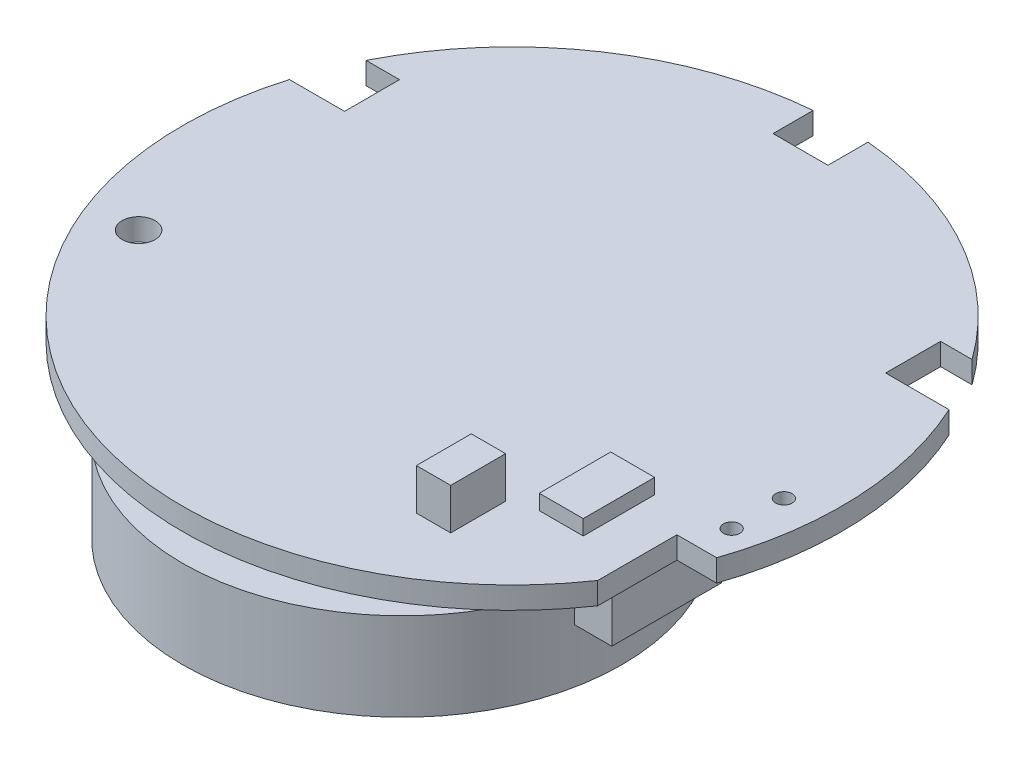
ISO-10303-21;
HEADER;
FILE_DESCRIPTION(('STEP AP214'),'2;1');
FILE_NAME('part.step','',(''),(''),'','','');
FILE_SCHEMA(('AUTOMOTIVE_DESIGN { 1 0 10303 214 1 1 1 1 }'));
ENDSEC;
DATA;
#1=APPLICATION_CONTEXT('core data for automotive mechanical design processes');
#2=APPLICATION_PROTOCOL_DEFINITION('international standard','automotive_design',2000,#1);
#3=PRODUCT_CONTEXT('',#1,'mechanical');
#4=PRODUCT('Part','Part','',(#3));
#5=PRODUCT_RELATED_PRODUCT_CATEGORY('part','',(#4));
#6=PRODUCT_DEFINITION_FORMATION('','',#4);
#7=PRODUCT_DEFINITION_CONTEXT('part definition',#1,'design');
#8=PRODUCT_DEFINITION('design','',#6,#7);
#9=PRODUCT_DEFINITION_SHAPE('','',#8);
#10=(LENGTH_UNIT() NAMED_UNIT(*) SI_UNIT(.MILLI.,.METRE.));
#11=(NAMED_UNIT(*) PLANE_ANGLE_UNIT() SI_UNIT($,.RADIAN.));
#12=(NAMED_UNIT(*) SI_UNIT($,.STERADIAN.) SOLID_ANGLE_UNIT());
#13=UNCERTAINTY_MEASURE_WITH_UNIT(LENGTH_MEASURE(1.E-05),#10,'distance_accuracy_value','');
#14=(GEOMETRIC_REPRESENTATION_CONTEXT(3) GLOBAL_UNCERTAINTY_ASSIGNED_CONTEXT((#13)) GLOBAL_UNIT_ASSIGNED_CONTEXT((#10,
#11,#12)) REPRESENTATION_CONTEXT('',''));
#15=CARTESIAN_POINT('',(0.,0.,0.));
#16=DIRECTION('',(0.,0.,1.));
#17=DIRECTION('',(1.,0.,0.));
#18=AXIS2_PLACEMENT_3D('',#15,#16,#17);
#19=CARTESIAN_POINT('',(0.,0.8,0.));
#20=DIRECTION('',(0.,1.,0.));
#21=DIRECTION('',(0.,0.,1.));
#22=AXIS2_PLACEMENT_3D('',#19,#20,#21);
#23=PLANE('',#22);
#24=DIRECTION('',(0.,0.,1.));
#25=VECTOR('',#24,1.);
#26=CARTESIAN_POINT('',(8.235,0.8,0.));
#27=LINE('',#26,#25);
#28=CARTESIAN_POINT('',(8.235,0.8,3.045));
#29=VERTEX_POINT('',#28);
#30=CARTESIAN_POINT('',(8.235,0.8,5.645));
#31=VERTEX_POINT('',#30);
#32=EDGE_CURVE('E248',#29,#31,#27,.T.);
#33=ORIENTED_EDGE('',*,*,#32,.T.);
#34=DIRECTION('',(1.,0.,0.));
#35=VECTOR('',#34,1.);
#36=CARTESIAN_POINT('',(0.,0.8,5.645));
#37=LINE('',#36,#35);
#38=CARTESIAN_POINT('',(6.635,0.8,5.645));
#39=VERTEX_POINT('',#38);
#40=EDGE_CURVE('E262',#39,#31,#37,.T.);
#41=ORIENTED_EDGE('',*,*,#40,.F.);
#42=DIRECTION('',(0.,0.,1.));
#43=VECTOR('',#42,1.);
#44=CARTESIAN_POINT('',(6.635,0.8,0.));
#45=LINE('',#44,#43);
#46=CARTESIAN_POINT('',(6.635,0.8,3.045));
#47=VERTEX_POINT('',#46);
#48=EDGE_CURVE('E275',#47,#39,#45,.T.);
#49=ORIENTED_EDGE('',*,*,#48,.F.);
#50=DIRECTION('',(1.,0.,0.));
#51=VECTOR('',#50,1.);
#52=CARTESIAN_POINT('',(0.,0.8,3.045));
#53=LINE('',#52,#51);
#54=EDGE_CURVE('E273',#47,#29,#53,.T.);
#55=ORIENTED_EDGE('',*,*,#54,.T.);
#56=EDGE_LOOP('',(#33,#41,#49,#55));
#57=FACE_BOUND('',#56,.T.);
#58=CARTESIAN_POINT('',(-9.50592004690098,0.8,4.09389595152663));
#59=DIRECTION('',(0.,1.,0.));
#60=DIRECTION('',(0.,0.,1.));
#61=AXIS2_PLACEMENT_3D('',#58,#59,#60);
#62=CIRCLE('',#61,0.6);
#63=CARTESIAN_POINT('',(-9.50592004690098,0.8,4.69389595152663));
#64=VERTEX_POINT('',#63);
#65=EDGE_CURVE('E387',#64,#64,#62,.T.);
#66=ORIENTED_EDGE('',*,*,#65,.F.);
#67=EDGE_LOOP('',(#66));
#68=FACE_BOUND('',#67,.T.);
#69=CARTESIAN_POINT('',(10.7026766628423,0.8,2.70819354010199));
#70=DIRECTION('',(0.,1.,0.));
#71=DIRECTION('',(0.,0.,1.));
#72=AXIS2_PLACEMENT_3D('',#69,#70,#71);
#73=CIRCLE('',#72,0.3);
#74=CARTESIAN_POINT('',(10.7026766628423,0.8,3.00819354010199));
#75=VERTEX_POINT('',#74);
#76=EDGE_CURVE('E393',#75,#75,#73,.T.);
#77=ORIENTED_EDGE('',*,*,#76,.F.);
#78=EDGE_LOOP('',(#77));
#79=FACE_BOUND('',#78,.T.);
#80=CARTESIAN_POINT('',(10.6997964827245,0.8,0.804521738846503));
#81=DIRECTION('',(0.,1.,0.));
#82=DIRECTION('',(0.,0.,1.));
#83=AXIS2_PLACEMENT_3D('',#80,#81,#82);
#84=CIRCLE('',#83,0.3);
#85=CARTESIAN_POINT('',(10.6997964827245,0.8,1.1045217388465));
#86=VERTEX_POINT('',#85);
#87=EDGE_CURVE('E382',#86,#86,#84,.T.);
#88=ORIENTED_EDGE('',*,*,#87,.F.);
#89=EDGE_LOOP('',(#88));
#90=FACE_BOUND('',#89,.T.);
#91=DIRECTION('',(0.,0.,1.));
#92=VECTOR('',#91,1.);
#93=CARTESIAN_POINT('',(-9.5,0.8,0.));
#94=LINE('',#93,#92);
#95=CARTESIAN_POINT('',(-9.5,0.8,-5.4));
#96=VERTEX_POINT('',#95);
#97=CARTESIAN_POINT('',(-9.5,0.8,-3.4));
#98=VERTEX_POINT('',#97);
#99=EDGE_CURVE('E409',#96,#98,#94,.T.);
#100=ORIENTED_EDGE('',*,*,#99,.T.);
#101=DIRECTION('',(-1.,0.,0.));
#102=VECTOR('',#101,1.);
#103=CARTESIAN_POINT('',(0.,0.8,-3.4));
#104=LINE('',#103,#102);
#105=CARTESIAN_POINT('',(-11.5082579046526,0.8,-3.4));
#106=VERTEX_POINT('',#105);
#107=EDGE_CURVE('E404',#98,#106,#104,.T.);
#108=ORIENTED_EDGE('',*,*,#107,.T.);
#109=CARTESIAN_POINT('',(0.,0.8,0.));
#110=DIRECTION('',(0.,1.,0.));
#111=DIRECTION('',(0.,0.,1.));
#112=AXIS2_PLACEMENT_3D('',#109,#110,#111);
#113=CIRCLE('',#112,12.);
#114=CARTESIAN_POINT('',(9.9,0.8,6.78159273327439));
#115=VERTEX_POINT('',#114);
#116=EDGE_CURVE('E45',#106,#115,#113,.T.);
#117=ORIENTED_EDGE('',*,*,#116,.T.);
#118=DIRECTION('',(0.,0.,-1.));
#119=VECTOR('',#118,1.);
#120=CARTESIAN_POINT('',(9.9,0.8,0.));
#121=LINE('',#120,#119);
#122=CARTESIAN_POINT('',(9.9,0.8,3.9));
#123=VERTEX_POINT('',#122);
#124=EDGE_CURVE('E481',#115,#123,#121,.T.);
#125=ORIENTED_EDGE('',*,*,#124,.T.);
#126=DIRECTION('',(1.,0.,0.));
#127=VECTOR('',#126,1.);
#128=CARTESIAN_POINT('',(0.,0.8,3.9));
#129=LINE('',#128,#127);
#130=CARTESIAN_POINT('',(11.3485681916266,0.8,3.9));
#131=VERTEX_POINT('',#130);
#132=EDGE_CURVE('E386',#123,#131,#129,.T.);
#133=ORIENTED_EDGE('',*,*,#132,.T.);
#134=CARTESIAN_POINT('',(10.9087121146357,0.8,-5.));
#135=VERTEX_POINT('',#134);
#136=EDGE_CURVE('E11',#131,#135,#113,.T.);
#137=ORIENTED_EDGE('',*,*,#136,.T.);
#138=DIRECTION('',(1.,0.,0.));
#139=VECTOR('',#138,1.);
#140=CARTESIAN_POINT('',(0.,0.8,-5.));
#141=LINE('',#140,#139);
#142=CARTESIAN_POINT('',(8.6,0.8,-5.));
#143=VERTEX_POINT('',#142);
#144=EDGE_CURVE('E466',#143,#135,#141,.T.);
#145=ORIENTED_EDGE('',*,*,#144,.F.);
#146=DIRECTION('',(0.,0.,1.));
#147=VECTOR('',#146,1.);
#148=CARTESIAN_POINT('',(8.6,0.8,0.));
#149=LINE('',#148,#147);
#150=CARTESIAN_POINT('',(8.6,0.8,-7.));
#151=VERTEX_POINT('',#150);
#152=EDGE_CURVE('E463',#151,#143,#149,.T.);
#153=ORIENTED_EDGE('',*,*,#152,.F.);
#154=DIRECTION('',(-1.,0.,0.));
#155=VECTOR('',#154,1.);
#156=CARTESIAN_POINT('',(0.,0.8,-7.));
#157=LINE('',#156,#155);
#158=CARTESIAN_POINT('',(9.74679434480897,0.8,-7.));
#159=VERTEX_POINT('',#158);
#160=EDGE_CURVE('E456',#159,#151,#157,.T.);
#161=ORIENTED_EDGE('',*,*,#160,.F.);
#162=CARTESIAN_POINT('',(1.,0.8,-11.9582607431014));
#163=VERTEX_POINT('',#162);
#164=EDGE_CURVE('E44',#159,#163,#113,.T.);
#165=ORIENTED_EDGE('',*,*,#164,.T.);
#166=DIRECTION('',(0.,0.,1.));
#167=VECTOR('',#166,1.);
#168=CARTESIAN_POINT('',(1.,0.8,0.));
#169=LINE('',#168,#167);
#170=CARTESIAN_POINT('',(1.,0.8,-10.5));
#171=VERTEX_POINT('',#170);
#172=EDGE_CURVE('E430',#163,#171,#169,.T.);
#173=ORIENTED_EDGE('',*,*,#172,.T.);
#174=DIRECTION('',(-1.,0.,0.));
#175=VECTOR('',#174,1.);
#176=CARTESIAN_POINT('',(0.,0.8,-10.5));
#177=LINE('',#176,#175);
#178=CARTESIAN_POINT('',(-0.999999999999999,0.8,-10.5));
#179=VERTEX_POINT('',#178);
#180=EDGE_CURVE('E439',#171,#179,#177,.T.);
#181=ORIENTED_EDGE('',*,*,#180,.T.);
#182=DIRECTION('',(0.,0.,-1.));
#183=VECTOR('',#182,1.);
#184=CARTESIAN_POINT('',(-0.999999999999997,0.8,0.));
#185=LINE('',#184,#183);
#186=CARTESIAN_POINT('',(-0.999999999999999,0.8,-11.9582607431014));
#187=VERTEX_POINT('',#186);
#188=EDGE_CURVE('E436',#179,#187,#185,.T.);
#189=ORIENTED_EDGE('',*,*,#188,.T.);
#190=CARTESIAN_POINT('',(-10.7163426596951,0.8,-5.4));
#191=VERTEX_POINT('',#190);
#192=EDGE_CURVE('E493',#187,#191,#113,.T.);
#193=ORIENTED_EDGE('',*,*,#192,.T.);
#194=DIRECTION('',(1.,0.,0.));
#195=VECTOR('',#194,1.);
#196=CARTESIAN_POINT('',(0.,0.8,-5.4));
#197=LINE('',#196,#195);
#198=EDGE_CURVE('E412',#191,#96,#197,.T.);
#199=ORIENTED_EDGE('',*,*,#198,.T.);
#200=EDGE_LOOP('',(#100,#108,#117,#125,#133,#137,#145,#153,#161,#165,#173,#181,#189,#193,#199));
#201=FACE_BOUND('',#200,.T.);
#202=DIRECTION('',(-1.,0.,0.));
#203=VECTOR('',#202,1.);
#204=CARTESIAN_POINT('',(4.475,0.8,5.96));
#205=LINE('',#204,#203);
#206=CARTESIAN_POINT('',(5.725,0.8,5.96));
#207=VERTEX_POINT('',#206);
#208=CARTESIAN_POINT('',(4.475,0.8,5.96));
#209=VERTEX_POINT('',#208);
#210=EDGE_CURVE('E294',#207,#209,#205,.T.);
#211=ORIENTED_EDGE('',*,*,#210,.F.);
#212=DIRECTION('',(0.,0.,-1.));
#213=VECTOR('',#212,1.);
#214=CARTESIAN_POINT('',(5.725,0.8,5.96));
#215=LINE('',#214,#213);
#216=CARTESIAN_POINT('',(5.725,0.8,7.96));
#217=VERTEX_POINT('',#216);
#218=EDGE_CURVE('E253',#217,#207,#215,.T.);
#219=ORIENTED_EDGE('',*,*,#218,.F.);
#220=DIRECTION('',(1.,0.,0.));
#221=VECTOR('',#220,1.);
#222=CARTESIAN_POINT('',(4.475,0.8,7.96));
#223=LINE('',#222,#221);
#224=CARTESIAN_POINT('',(4.475,0.8,7.96));
#225=VERTEX_POINT('',#224);
#226=EDGE_CURVE('E285',#225,#217,#223,.T.);
#227=ORIENTED_EDGE('',*,*,#226,.F.);
#228=DIRECTION('',(0.,0.,1.));
#229=VECTOR('',#228,1.);
#230=CARTESIAN_POINT('',(4.475,0.8,5.96));
#231=LINE('',#230,#229);
#232=EDGE_CURVE('E296',#209,#225,#231,.T.);
#233=ORIENTED_EDGE('',*,*,#232,.F.);
#234=EDGE_LOOP('',(#211,#219,#227,#233));
#235=FACE_BOUND('',#234,.T.);
#236=ADVANCED_FACE('F35',(#57,#68,#79,#90,#201,#235),#23,.T.);
#237=CARTESIAN_POINT('',(0.,0.,0.));
#238=DIRECTION('',(0.,1.,0.));
#239=DIRECTION('',(0.,0.,1.));
#240=AXIS2_PLACEMENT_3D('',#237,#238,#239);
#241=PLANE('',#240);
#242=DIRECTION('',(0.,0.,-1.));
#243=VECTOR('',#242,1.);
#244=CARTESIAN_POINT('',(-4.,0.,2.));
#245=LINE('',#244,#243);
#246=CARTESIAN_POINT('',(-4.,0.,6.));
#247=VERTEX_POINT('',#246);
#248=CARTESIAN_POINT('',(-4.,0.,2.));
#249=VERTEX_POINT('',#248);
#250=EDGE_CURVE('E344',#247,#249,#245,.T.);
#251=ORIENTED_EDGE('',*,*,#250,.F.);
#252=DIRECTION('',(-1.,0.,0.));
#253=VECTOR('',#252,1.);
#254=CARTESIAN_POINT('',(4.,0.,6.));
#255=LINE('',#254,#253);
#256=CARTESIAN_POINT('',(4.,0.,6.));
#257=VERTEX_POINT('',#256);
#258=EDGE_CURVE('E351',#257,#247,#255,.T.);
#259=ORIENTED_EDGE('',*,*,#258,.F.);
#260=DIRECTION('',(0.,0.,1.));
#261=VECTOR('',#260,1.);
#262=CARTESIAN_POINT('',(4.,0.,2.));
#263=LINE('',#262,#261);
#264=CARTESIAN_POINT('',(4.,0.,2.));
#265=VERTEX_POINT('',#264);
#266=EDGE_CURVE('E366',#265,#257,#263,.T.);
#267=ORIENTED_EDGE('',*,*,#266,.F.);
#268=DIRECTION('',(1.,0.,0.));
#269=VECTOR('',#268,1.);
#270=CARTESIAN_POINT('',(4.,0.,2.));
#271=LINE('',#270,#269);
#272=EDGE_CURVE('E363',#249,#265,#271,.T.);
#273=ORIENTED_EDGE('',*,*,#272,.F.);
#274=EDGE_LOOP('',(#251,#259,#267,#273));
#275=FACE_BOUND('',#274,.T.);
#276=CARTESIAN_POINT('',(-9.50592004690098,0.,4.09389595152663));
#277=DIRECTION('',(0.,1.,0.));
#278=DIRECTION('',(0.,0.,1.));
#279=AXIS2_PLACEMENT_3D('',#276,#277,#278);
#280=CIRCLE('',#279,0.6);
#281=CARTESIAN_POINT('',(-9.50592004690098,0.,4.69389595152663));
#282=VERTEX_POINT('',#281);
#283=EDGE_CURVE('E383',#282,#282,#280,.T.);
#284=ORIENTED_EDGE('',*,*,#283,.T.);
#285=EDGE_LOOP('',(#284));
#286=FACE_BOUND('',#285,.T.);
#287=CARTESIAN_POINT('',(10.7026766628423,0.,2.70819354010199));
#288=DIRECTION('',(0.,1.,0.));
#289=DIRECTION('',(0.,0.,1.));
#290=AXIS2_PLACEMENT_3D('',#287,#288,#289);
#291=CIRCLE('',#290,0.3);
#292=CARTESIAN_POINT('',(10.7026766628423,0.,3.00819354010199));
#293=VERTEX_POINT('',#292);
#294=EDGE_CURVE('E390',#293,#293,#291,.T.);
#295=ORIENTED_EDGE('',*,*,#294,.T.);
#296=EDGE_LOOP('',(#295));
#297=FACE_BOUND('',#296,.T.);
#298=CARTESIAN_POINT('',(10.6997964827245,0.,0.804521738846503));
#299=DIRECTION('',(0.,1.,0.));
#300=DIRECTION('',(0.,0.,1.));
#301=AXIS2_PLACEMENT_3D('',#298,#299,#300);
#302=CIRCLE('',#301,0.3);
#303=CARTESIAN_POINT('',(10.6997964827245,0.,1.1045217388465));
#304=VERTEX_POINT('',#303);
#305=EDGE_CURVE('E396',#304,#304,#302,.T.);
#306=ORIENTED_EDGE('',*,*,#305,.T.);
#307=EDGE_LOOP('',(#306));
#308=FACE_BOUND('',#307,.T.);
#309=DIRECTION('',(-1.,0.,0.));
#310=VECTOR('',#309,1.);
#311=CARTESIAN_POINT('',(0.,0.,-3.4));
#312=LINE('',#311,#310);
#313=CARTESIAN_POINT('',(-9.5,0.,-3.4));
#314=VERTEX_POINT('',#313);
#315=CARTESIAN_POINT('',(-11.5082579046526,0.,-3.4));
#316=VERTEX_POINT('',#315);
#317=EDGE_CURVE('E406',#314,#316,#312,.T.);
#318=ORIENTED_EDGE('',*,*,#317,.F.);
#319=DIRECTION('',(0.,0.,1.));
#320=VECTOR('',#319,1.);
#321=CARTESIAN_POINT('',(-9.5,0.,0.));
#322=LINE('',#321,#320);
#323=CARTESIAN_POINT('',(-9.5,0.,-5.4));
#324=VERTEX_POINT('',#323);
#325=EDGE_CURVE('E401',#324,#314,#322,.T.);
#326=ORIENTED_EDGE('',*,*,#325,.F.);
#327=DIRECTION('',(1.,0.,0.));
#328=VECTOR('',#327,1.);
#329=CARTESIAN_POINT('',(0.,0.,-5.4));
#330=LINE('',#329,#328);
#331=CARTESIAN_POINT('',(-10.7163426596951,0.,-5.4));
#332=VERTEX_POINT('',#331);
#333=EDGE_CURVE('E403',#332,#324,#330,.T.);
#334=ORIENTED_EDGE('',*,*,#333,.F.);
#335=CARTESIAN_POINT('',(0.,0.,0.));
#336=DIRECTION('',(0.,1.,0.));
#337=DIRECTION('',(0.,0.,1.));
#338=AXIS2_PLACEMENT_3D('',#335,#336,#337);
#339=CIRCLE('',#338,12.);
#340=CARTESIAN_POINT('',(-0.999999999999999,0.,-11.9582607431014));
#341=VERTEX_POINT('',#340);
#342=EDGE_CURVE('E504',#341,#332,#339,.T.);
#343=ORIENTED_EDGE('',*,*,#342,.F.);
#344=DIRECTION('',(0.,0.,-1.));
#345=VECTOR('',#344,1.);
#346=CARTESIAN_POINT('',(-0.999999999999997,0.,0.));
#347=LINE('',#346,#345);
#348=CARTESIAN_POINT('',(-0.999999999999999,0.,-10.5));
#349=VERTEX_POINT('',#348);
#350=EDGE_CURVE('E427',#349,#341,#347,.T.);
#351=ORIENTED_EDGE('',*,*,#350,.F.);
#352=DIRECTION('',(-1.,0.,0.));
#353=VECTOR('',#352,1.);
#354=CARTESIAN_POINT('',(0.,0.,-10.5));
#355=LINE('',#354,#353);
#356=CARTESIAN_POINT('',(1.,0.,-10.5));
#357=VERTEX_POINT('',#356);
#358=EDGE_CURVE('E429',#357,#349,#355,.T.);
#359=ORIENTED_EDGE('',*,*,#358,.F.);
#360=DIRECTION('',(0.,0.,1.));
#361=VECTOR('',#360,1.);
#362=CARTESIAN_POINT('',(1.,0.,0.));
#363=LINE('',#362,#361);
#364=CARTESIAN_POINT('',(1.,0.,-11.9582607431014));
#365=VERTEX_POINT('',#364);
#366=EDGE_CURVE('E432',#365,#357,#363,.T.);
#367=ORIENTED_EDGE('',*,*,#366,.F.);
#368=CARTESIAN_POINT('',(9.74679434480897,0.,-7.));
#369=VERTEX_POINT('',#368);
#370=EDGE_CURVE('E499',#369,#365,#339,.T.);
#371=ORIENTED_EDGE('',*,*,#370,.F.);
#372=DIRECTION('',(-1.,0.,0.));
#373=VECTOR('',#372,1.);
#374=CARTESIAN_POINT('',(0.,0.,-7.));
#375=LINE('',#374,#373);
#376=CARTESIAN_POINT('',(8.6,0.,-7.));
#377=VERTEX_POINT('',#376);
#378=EDGE_CURVE('E459',#369,#377,#375,.T.);
#379=ORIENTED_EDGE('',*,*,#378,.T.);
#380=DIRECTION('',(0.,0.,1.));
#381=VECTOR('',#380,1.);
#382=CARTESIAN_POINT('',(8.6,0.,0.));
#383=LINE('',#382,#381);
#384=CARTESIAN_POINT('',(8.6,0.,-5.));
#385=VERTEX_POINT('',#384);
#386=EDGE_CURVE('E452',#377,#385,#383,.T.);
#387=ORIENTED_EDGE('',*,*,#386,.T.);
#388=DIRECTION('',(1.,0.,0.));
#389=VECTOR('',#388,1.);
#390=CARTESIAN_POINT('',(0.,0.,-5.));
#391=LINE('',#390,#389);
#392=CARTESIAN_POINT('',(10.9087121146357,0.,-5.));
#393=VERTEX_POINT('',#392);
#394=EDGE_CURVE('E455',#385,#393,#391,.T.);
#395=ORIENTED_EDGE('',*,*,#394,.T.);
#396=CARTESIAN_POINT('',(11.3485681916266,0.,3.9));
#397=VERTEX_POINT('',#396);
#398=EDGE_CURVE('E494',#397,#393,#339,.T.);
#399=ORIENTED_EDGE('',*,*,#398,.F.);
#400=DIRECTION('',(1.,0.,0.));
#401=VECTOR('',#400,1.);
#402=CARTESIAN_POINT('',(0.,0.,3.9));
#403=LINE('',#402,#401);
#404=CARTESIAN_POINT('',(9.9,0.,3.9));
#405=VERTEX_POINT('',#404);
#406=EDGE_CURVE('E478',#405,#397,#403,.T.);
#407=ORIENTED_EDGE('',*,*,#406,.F.);
#408=DIRECTION('',(0.,0.,-1.));
#409=VECTOR('',#408,1.);
#410=CARTESIAN_POINT('',(9.9,0.,0.));
#411=LINE('',#410,#409);
#412=CARTESIAN_POINT('',(9.9,0.,6.78159273327439));
#413=VERTEX_POINT('',#412);
#414=EDGE_CURVE('E480',#413,#405,#411,.T.);
#415=ORIENTED_EDGE('',*,*,#414,.F.);
#416=EDGE_CURVE('E39',#316,#413,#339,.T.);
#417=ORIENTED_EDGE('',*,*,#416,.F.);
#418=EDGE_LOOP('',(#318,#326,#334,#343,#351,#359,#367,#371,#379,#387,#395,#399,#407,#415,#417));
#419=FACE_BOUND('',#418,.T.);
#420=DIRECTION('',(-1.,0.,0.));
#421=VECTOR('',#420,1.);
#422=CARTESIAN_POINT('',(8.28,0.,6.));
#423=LINE('',#422,#421);
#424=CARTESIAN_POINT('',(9.63,0.,6.));
#425=VERTEX_POINT('',#424);
#426=CARTESIAN_POINT('',(8.28,0.,6.));
#427=VERTEX_POINT('',#426);
#428=EDGE_CURVE('E307',#425,#427,#423,.T.);
#429=ORIENTED_EDGE('',*,*,#428,.F.);
#430=DIRECTION('',(0.,0.,1.));
#431=VECTOR('',#430,1.);
#432=CARTESIAN_POINT('',(9.63,0.,6.));
#433=LINE('',#432,#431);
#434=CARTESIAN_POINT('',(9.63,0.,2.));
#435=VERTEX_POINT('',#434);
#436=EDGE_CURVE('E312',#435,#425,#433,.T.);
#437=ORIENTED_EDGE('',*,*,#436,.F.);
#438=DIRECTION('',(1.,0.,0.));
#439=VECTOR('',#438,1.);
#440=CARTESIAN_POINT('',(9.63,0.,2.));
#441=LINE('',#440,#439);
#442=CARTESIAN_POINT('',(8.28,0.,2.));
#443=VERTEX_POINT('',#442);
#444=EDGE_CURVE('E324',#443,#435,#441,.T.);
#445=ORIENTED_EDGE('',*,*,#444,.F.);
#446=DIRECTION('',(0.,0.,-1.));
#447=VECTOR('',#446,1.);
#448=CARTESIAN_POINT('',(8.28,0.,2.));
#449=LINE('',#448,#447);
#450=EDGE_CURVE('E321',#427,#443,#449,.T.);
#451=ORIENTED_EDGE('',*,*,#450,.F.);
#452=EDGE_LOOP('',(#429,#437,#445,#451));
#453=FACE_BOUND('',#452,.T.);
#454=ADVANCED_FACE('F519',(#275,#286,#297,#308,#419,#453),#241,.F.);
#455=CARTESIAN_POINT('',(0.,0.8,0.));
#456=DIRECTION('',(0.,-1.,0.));
#457=DIRECTION('',(0.,0.,-1.));
#458=AXIS2_PLACEMENT_3D('',#455,#456,#457);
#459=CYLINDRICAL_SURFACE('',#458,12.);
#460=DIRECTION('',(0.,1.,0.));
#461=VECTOR('',#460,1.);
#462=CARTESIAN_POINT('',(-11.5082579046526,0.,-3.4));
#463=LINE('',#462,#461);
#464=EDGE_CURVE('E421',#316,#106,#463,.T.);
#465=ORIENTED_EDGE('',*,*,#464,.F.);
#466=ORIENTED_EDGE('',*,*,#416,.T.);
#467=DIRECTION('',(0.,1.,0.));
#468=VECTOR('',#467,1.);
#469=CARTESIAN_POINT('',(9.9,0.,6.78159273327439));
#470=LINE('',#469,#468);
#471=EDGE_CURVE('E489',#413,#115,#470,.T.);
#472=ORIENTED_EDGE('',*,*,#471,.T.);
#473=ORIENTED_EDGE('',*,*,#116,.F.);
#474=EDGE_LOOP('',(#465,#466,#472,#473));
#475=FACE_BOUND('',#474,.T.);
#476=ADVANCED_FACE('F37',(#475),#459,.T.);
#477=DIRECTION('',(0.,1.,0.));
#478=VECTOR('',#477,1.);
#479=CARTESIAN_POINT('',(-10.7163426596951,0.,-5.4));
#480=LINE('',#479,#478);
#481=EDGE_CURVE('E423',#332,#191,#480,.T.);
#482=ORIENTED_EDGE('',*,*,#481,.T.);
#483=ORIENTED_EDGE('',*,*,#192,.F.);
#484=DIRECTION('',(0.,1.,0.));
#485=VECTOR('',#484,1.);
#486=CARTESIAN_POINT('',(-0.999999999999999,0.,-11.9582607431014));
#487=LINE('',#486,#485);
#488=EDGE_CURVE('E413',#341,#187,#487,.T.);
#489=ORIENTED_EDGE('',*,*,#488,.F.);
#490=ORIENTED_EDGE('',*,*,#342,.T.);
#491=EDGE_LOOP('',(#482,#483,#489,#490));
#492=FACE_BOUND('',#491,.T.);
#493=ADVANCED_FACE('F513',(#492),#459,.T.);
#494=DIRECTION('',(0.,1.,0.));
#495=VECTOR('',#494,1.);
#496=CARTESIAN_POINT('',(1.,0.,-11.9582607431014));
#497=LINE('',#496,#495);
#498=EDGE_CURVE('E446',#365,#163,#497,.T.);
#499=ORIENTED_EDGE('',*,*,#498,.T.);
#500=ORIENTED_EDGE('',*,*,#164,.F.);
#501=DIRECTION('',(0.,1.,0.));
#502=VECTOR('',#501,1.);
#503=CARTESIAN_POINT('',(9.74679434480897,0.,-7.));
#504=LINE('',#503,#502);
#505=EDGE_CURVE('E472',#369,#159,#504,.T.);
#506=ORIENTED_EDGE('',*,*,#505,.F.);
#507=ORIENTED_EDGE('',*,*,#370,.T.);
#508=EDGE_LOOP('',(#499,#500,#506,#507));
#509=FACE_BOUND('',#508,.T.);
#510=ADVANCED_FACE('F543',(#509),#459,.T.);
#511=ORIENTED_EDGE('',*,*,#398,.T.);
#512=DIRECTION('',(0.,1.,0.));
#513=VECTOR('',#512,1.);
#514=CARTESIAN_POINT('',(10.9087121146357,0.,-5.));
#515=LINE('',#514,#513);
#516=EDGE_CURVE('E474',#393,#135,#515,.T.);
#517=ORIENTED_EDGE('',*,*,#516,.T.);
#518=ORIENTED_EDGE('',*,*,#136,.F.);
#519=DIRECTION('',(0.,1.,0.));
#520=VECTOR('',#519,1.);
#521=CARTESIAN_POINT('',(11.3485681916266,0.,3.9));
#522=LINE('',#521,#520);
#523=EDGE_CURVE('E467',#397,#131,#522,.T.);
#524=ORIENTED_EDGE('',*,*,#523,.F.);
#525=EDGE_LOOP('',(#511,#517,#518,#524));
#526=FACE_BOUND('',#525,.T.);
#527=ADVANCED_FACE('F559',(#526),#459,.T.);
#528=CARTESIAN_POINT('',(0.,0.,3.9));
#529=DIRECTION('',(0.,0.,1.));
#530=DIRECTION('',(1.,0.,0.));
#531=AXIS2_PLACEMENT_3D('',#528,#529,#530);
#532=PLANE('',#531);
#533=ORIENTED_EDGE('',*,*,#132,.F.);
#534=DIRECTION('',(0.,1.,0.));
#535=VECTOR('',#534,1.);
#536=CARTESIAN_POINT('',(9.9,0.,3.9));
#537=LINE('',#536,#535);
#538=EDGE_CURVE('E483',#405,#123,#537,.T.);
#539=ORIENTED_EDGE('',*,*,#538,.F.);
#540=ORIENTED_EDGE('',*,*,#406,.T.);
#541=ORIENTED_EDGE('',*,*,#523,.T.);
#542=EDGE_LOOP('',(#533,#539,#540,#541));
#543=FACE_BOUND('',#542,.T.);
#544=ADVANCED_FACE('F563',(#543),#532,.T.);
#545=CARTESIAN_POINT('',(9.9,0.,0.));
#546=DIRECTION('',(1.,0.,0.));
#547=DIRECTION('',(0.,0.,-1.));
#548=AXIS2_PLACEMENT_3D('',#545,#546,#547);
#549=PLANE('',#548);
#550=ORIENTED_EDGE('',*,*,#124,.F.);
#551=ORIENTED_EDGE('',*,*,#471,.F.);
#552=ORIENTED_EDGE('',*,*,#414,.T.);
#553=ORIENTED_EDGE('',*,*,#538,.T.);
#554=EDGE_LOOP('',(#550,#551,#552,#553));
#555=FACE_BOUND('',#554,.T.);
#556=ADVANCED_FACE('F566',(#555),#549,.T.);
#557=CARTESIAN_POINT('',(8.6,0.,0.));
#558=DIRECTION('',(-1.,0.,0.));
#559=DIRECTION('',(0.,0.,1.));
#560=AXIS2_PLACEMENT_3D('',#557,#558,#559);
#561=PLANE('',#560);
#562=ORIENTED_EDGE('',*,*,#152,.T.);
#563=DIRECTION('',(0.,1.,0.));
#564=VECTOR('',#563,1.);
#565=CARTESIAN_POINT('',(8.6,0.,-5.));
#566=LINE('',#565,#564);
#567=EDGE_CURVE('E462',#385,#143,#566,.T.);
#568=ORIENTED_EDGE('',*,*,#567,.F.);
#569=ORIENTED_EDGE('',*,*,#386,.F.);
#570=DIRECTION('',(0.,1.,0.));
#571=VECTOR('',#570,1.);
#572=CARTESIAN_POINT('',(8.6,0.,-7.));
#573=LINE('',#572,#571);
#574=EDGE_CURVE('E440',#377,#151,#573,.T.);
#575=ORIENTED_EDGE('',*,*,#574,.T.);
#576=EDGE_LOOP('',(#562,#568,#569,#575));
#577=FACE_BOUND('',#576,.T.);
#578=ADVANCED_FACE('F552',(#577),#561,.F.);
#579=CARTESIAN_POINT('',(0.,0.,-7.));
#580=DIRECTION('',(0.,0.,-1.));
#581=DIRECTION('',(-1.,0.,0.));
#582=AXIS2_PLACEMENT_3D('',#579,#580,#581);
#583=PLANE('',#582);
#584=ORIENTED_EDGE('',*,*,#160,.T.);
#585=ORIENTED_EDGE('',*,*,#574,.F.);
#586=ORIENTED_EDGE('',*,*,#378,.F.);
#587=ORIENTED_EDGE('',*,*,#505,.T.);
#588=EDGE_LOOP('',(#584,#585,#586,#587));
#589=FACE_BOUND('',#588,.T.);
#590=ADVANCED_FACE('F548',(#589),#583,.F.);
#591=CARTESIAN_POINT('',(0.,0.,-5.));
#592=DIRECTION('',(0.,0.,1.));
#593=DIRECTION('',(1.,0.,0.));
#594=AXIS2_PLACEMENT_3D('',#591,#592,#593);
#595=PLANE('',#594);
#596=ORIENTED_EDGE('',*,*,#144,.T.);
#597=ORIENTED_EDGE('',*,*,#516,.F.);
#598=ORIENTED_EDGE('',*,*,#394,.F.);
#599=ORIENTED_EDGE('',*,*,#567,.T.);
#600=EDGE_LOOP('',(#596,#597,#598,#599));
#601=FACE_BOUND('',#600,.T.);
#602=ADVANCED_FACE('F557',(#601),#595,.F.);
#603=CARTESIAN_POINT('',(-0.999999999999997,0.,0.));
#604=DIRECTION('',(1.,0.,0.));
#605=DIRECTION('',(0.,0.,-1.));
#606=AXIS2_PLACEMENT_3D('',#603,#604,#605);
#607=PLANE('',#606);
#608=ORIENTED_EDGE('',*,*,#188,.F.);
#609=DIRECTION('',(0.,1.,0.));
#610=VECTOR('',#609,1.);
#611=CARTESIAN_POINT('',(-0.999999999999999,0.,-10.5));
#612=LINE('',#611,#610);
#613=EDGE_CURVE('E435',#349,#179,#612,.T.);
#614=ORIENTED_EDGE('',*,*,#613,.F.);
#615=ORIENTED_EDGE('',*,*,#350,.T.);
#616=ORIENTED_EDGE('',*,*,#488,.T.);
#617=EDGE_LOOP('',(#608,#614,#615,#616));
#618=FACE_BOUND('',#617,.T.);
#619=ADVANCED_FACE('F535',(#618),#607,.T.);
#620=CARTESIAN_POINT('',(1.,0.,0.));
#621=DIRECTION('',(-1.,0.,0.));
#622=DIRECTION('',(0.,0.,1.));
#623=AXIS2_PLACEMENT_3D('',#620,#621,#622);
#624=PLANE('',#623);
#625=ORIENTED_EDGE('',*,*,#172,.F.);
#626=ORIENTED_EDGE('',*,*,#498,.F.);
#627=ORIENTED_EDGE('',*,*,#366,.T.);
#628=DIRECTION('',(0.,1.,0.));
#629=VECTOR('',#628,1.);
#630=CARTESIAN_POINT('',(1.,0.,-10.5));
#631=LINE('',#630,#629);
#632=EDGE_CURVE('E449',#357,#171,#631,.T.);
#633=ORIENTED_EDGE('',*,*,#632,.T.);
#634=EDGE_LOOP('',(#625,#626,#627,#633));
#635=FACE_BOUND('',#634,.T.);
#636=ADVANCED_FACE('F602',(#635),#624,.T.);
#637=CARTESIAN_POINT('',(0.,0.,-10.5));
#638=DIRECTION('',(0.,0.,-1.));
#639=DIRECTION('',(-1.,0.,0.));
#640=AXIS2_PLACEMENT_3D('',#637,#638,#639);
#641=PLANE('',#640);
#642=ORIENTED_EDGE('',*,*,#180,.F.);
#643=ORIENTED_EDGE('',*,*,#632,.F.);
#644=ORIENTED_EDGE('',*,*,#358,.T.);
#645=ORIENTED_EDGE('',*,*,#613,.T.);
#646=EDGE_LOOP('',(#642,#643,#644,#645));
#647=FACE_BOUND('',#646,.T.);
#648=ADVANCED_FACE('F537',(#647),#641,.T.);
#649=CARTESIAN_POINT('',(-9.5,0.,0.));
#650=DIRECTION('',(-1.,0.,0.));
#651=DIRECTION('',(0.,0.,1.));
#652=AXIS2_PLACEMENT_3D('',#649,#650,#651);
#653=PLANE('',#652);
#654=ORIENTED_EDGE('',*,*,#99,.F.);
#655=DIRECTION('',(0.,1.,0.));
#656=VECTOR('',#655,1.);
#657=CARTESIAN_POINT('',(-9.5,0.,-5.4));
#658=LINE('',#657,#656);
#659=EDGE_CURVE('E408',#324,#96,#658,.T.);
#660=ORIENTED_EDGE('',*,*,#659,.F.);
#661=ORIENTED_EDGE('',*,*,#325,.T.);
#662=DIRECTION('',(0.,1.,0.));
#663=VECTOR('',#662,1.);
#664=CARTESIAN_POINT('',(-9.5,0.,-3.4));
#665=LINE('',#664,#663);
#666=EDGE_CURVE('E418',#314,#98,#665,.T.);
#667=ORIENTED_EDGE('',*,*,#666,.T.);
#668=EDGE_LOOP('',(#654,#660,#661,#667));
#669=FACE_BOUND('',#668,.T.);
#670=ADVANCED_FACE('F528',(#669),#653,.T.);
#671=CARTESIAN_POINT('',(0.,0.,-3.4));
#672=DIRECTION('',(0.,0.,-1.));
#673=DIRECTION('',(-1.,0.,0.));
#674=AXIS2_PLACEMENT_3D('',#671,#672,#673);
#675=PLANE('',#674);
#676=ORIENTED_EDGE('',*,*,#107,.F.);
#677=ORIENTED_EDGE('',*,*,#666,.F.);
#678=ORIENTED_EDGE('',*,*,#317,.T.);
#679=ORIENTED_EDGE('',*,*,#464,.T.);
#680=EDGE_LOOP('',(#676,#677,#678,#679));
#681=FACE_BOUND('',#680,.T.);
#682=ADVANCED_FACE('F568',(#681),#675,.T.);
#683=CARTESIAN_POINT('',(0.,0.,-5.4));
#684=DIRECTION('',(0.,0.,1.));
#685=DIRECTION('',(1.,0.,0.));
#686=AXIS2_PLACEMENT_3D('',#683,#684,#685);
#687=PLANE('',#686);
#688=ORIENTED_EDGE('',*,*,#198,.F.);
#689=ORIENTED_EDGE('',*,*,#481,.F.);
#690=ORIENTED_EDGE('',*,*,#333,.T.);
#691=ORIENTED_EDGE('',*,*,#659,.T.);
#692=EDGE_LOOP('',(#688,#689,#690,#691));
#693=FACE_BOUND('',#692,.T.);
#694=ADVANCED_FACE('F525',(#693),#687,.T.);
#695=CARTESIAN_POINT('',(10.6997964827245,0.,0.804521738846503));
#696=DIRECTION('',(0.,1.,0.));
#697=DIRECTION('',(0.,0.,1.));
#698=AXIS2_PLACEMENT_3D('',#695,#696,#697);
#699=CYLINDRICAL_SURFACE('',#698,0.3);
#700=ORIENTED_EDGE('',*,*,#305,.F.);
#701=EDGE_LOOP('',(#700));
#702=FACE_BOUND('',#701,.T.);
#703=ORIENTED_EDGE('',*,*,#87,.T.);
#704=EDGE_LOOP('',(#703));
#705=FACE_BOUND('',#704,.T.);
#706=ADVANCED_FACE('F575',(#702,#705),#699,.F.);
#707=CARTESIAN_POINT('',(10.7026766628423,0.,2.70819354010199));
#708=DIRECTION('',(0.,1.,0.));
#709=DIRECTION('',(0.,0.,1.));
#710=AXIS2_PLACEMENT_3D('',#707,#708,#709);
#711=CYLINDRICAL_SURFACE('',#710,0.3);
#712=ORIENTED_EDGE('',*,*,#294,.F.);
#713=EDGE_LOOP('',(#712));
#714=FACE_BOUND('',#713,.T.);
#715=ORIENTED_EDGE('',*,*,#76,.T.);
#716=EDGE_LOOP('',(#715));
#717=FACE_BOUND('',#716,.T.);
#718=ADVANCED_FACE('F637',(#714,#717),#711,.F.);
#719=CARTESIAN_POINT('',(-9.50592004690098,0.,4.09389595152663));
#720=DIRECTION('',(0.,1.,0.));
#721=DIRECTION('',(0.,0.,1.));
#722=AXIS2_PLACEMENT_3D('',#719,#720,#721);
#723=CYLINDRICAL_SURFACE('',#722,0.6);
#724=ORIENTED_EDGE('',*,*,#283,.F.);
#725=EDGE_LOOP('',(#724));
#726=FACE_BOUND('',#725,.T.);
#727=ORIENTED_EDGE('',*,*,#65,.T.);
#728=EDGE_LOOP('',(#727));
#729=FACE_BOUND('',#728,.T.);
#730=ADVANCED_FACE('F646',(#726,#729),#723,.F.);
#731=CARTESIAN_POINT('',(-4.,-1.,2.));
#732=DIRECTION('',(1.,0.,0.));
#733=DIRECTION('',(0.,0.,-1.));
#734=AXIS2_PLACEMENT_3D('',#731,#732,#733);
#735=PLANE('',#734);
#736=ORIENTED_EDGE('',*,*,#250,.T.);
#737=DIRECTION('',(0.,1.,0.));
#738=VECTOR('',#737,1.);
#739=CARTESIAN_POINT('',(-4.,-1.,2.));
#740=LINE('',#739,#738);
#741=CARTESIAN_POINT('',(-4.,-1.,2.));
#742=VERTEX_POINT('',#741);
#743=EDGE_CURVE('E379',#742,#249,#740,.T.);
#744=ORIENTED_EDGE('',*,*,#743,.F.);
#745=DIRECTION('',(0.,0.,-1.));
#746=VECTOR('',#745,1.);
#747=CARTESIAN_POINT('',(-4.,-1.,2.));
#748=LINE('',#747,#746);
#749=CARTESIAN_POINT('',(-4.,-1.,6.));
#750=VERTEX_POINT('',#749);
#751=EDGE_CURVE('E347',#750,#742,#748,.T.);
#752=ORIENTED_EDGE('',*,*,#751,.F.);
#753=DIRECTION('',(0.,1.,0.));
#754=VECTOR('',#753,1.);
#755=CARTESIAN_POINT('',(-4.,-1.,6.));
#756=LINE('',#755,#754);
#757=EDGE_CURVE('E360',#750,#247,#756,.T.);
#758=ORIENTED_EDGE('',*,*,#757,.T.);
#759=EDGE_LOOP('',(#736,#744,#752,#758));
#760=FACE_BOUND('',#759,.T.);
#761=ADVANCED_FACE('F656',(#760),#735,.F.);
#762=CARTESIAN_POINT('',(4.,-1.,2.));
#763=DIRECTION('',(0.,0.,1.));
#764=DIRECTION('',(1.,0.,0.));
#765=AXIS2_PLACEMENT_3D('',#762,#763,#764);
#766=PLANE('',#765);
#767=ORIENTED_EDGE('',*,*,#272,.T.);
#768=DIRECTION('',(0.,1.,0.));
#769=VECTOR('',#768,1.);
#770=CARTESIAN_POINT('',(4.,-1.,2.));
#771=LINE('',#770,#769);
#772=CARTESIAN_POINT('',(4.,-1.,2.));
#773=VERTEX_POINT('',#772);
#774=EDGE_CURVE('E376',#773,#265,#771,.T.);
#775=ORIENTED_EDGE('',*,*,#774,.F.);
#776=DIRECTION('',(1.,0.,0.));
#777=VECTOR('',#776,1.);
#778=CARTESIAN_POINT('',(4.,-1.,2.));
#779=LINE('',#778,#777);
#780=EDGE_CURVE('E350',#742,#773,#779,.T.);
#781=ORIENTED_EDGE('',*,*,#780,.F.);
#782=ORIENTED_EDGE('',*,*,#743,.T.);
#783=EDGE_LOOP('',(#767,#775,#781,#782));
#784=FACE_BOUND('',#783,.T.);
#785=ADVANCED_FACE('F666',(#784),#766,.F.);
#786=CARTESIAN_POINT('',(4.,-1.,2.));
#787=DIRECTION('',(-1.,0.,0.));
#788=DIRECTION('',(0.,0.,1.));
#789=AXIS2_PLACEMENT_3D('',#786,#787,#788);
#790=PLANE('',#789);
#791=ORIENTED_EDGE('',*,*,#266,.T.);
#792=DIRECTION('',(0.,1.,0.));
#793=VECTOR('',#792,1.);
#794=CARTESIAN_POINT('',(4.,-1.,6.));
#795=LINE('',#794,#793);
#796=CARTESIAN_POINT('',(4.,-1.,6.));
#797=VERTEX_POINT('',#796);
#798=EDGE_CURVE('E373',#797,#257,#795,.T.);
#799=ORIENTED_EDGE('',*,*,#798,.F.);
#800=DIRECTION('',(0.,0.,1.));
#801=VECTOR('',#800,1.);
#802=CARTESIAN_POINT('',(4.,-1.,2.));
#803=LINE('',#802,#801);
#804=EDGE_CURVE('E354',#773,#797,#803,.T.);
#805=ORIENTED_EDGE('',*,*,#804,.F.);
#806=ORIENTED_EDGE('',*,*,#774,.T.);
#807=EDGE_LOOP('',(#791,#799,#805,#806));
#808=FACE_BOUND('',#807,.T.);
#809=ADVANCED_FACE('F676',(#808),#790,.F.);
#810=CARTESIAN_POINT('',(4.,-1.,6.));
#811=DIRECTION('',(0.,0.,-1.));
#812=DIRECTION('',(-1.,0.,0.));
#813=AXIS2_PLACEMENT_3D('',#810,#811,#812);
#814=PLANE('',#813);
#815=ORIENTED_EDGE('',*,*,#258,.T.);
#816=ORIENTED_EDGE('',*,*,#757,.F.);
#817=DIRECTION('',(-1.,0.,0.));
#818=VECTOR('',#817,1.);
#819=CARTESIAN_POINT('',(4.,-1.,6.));
#820=LINE('',#819,#818);
#821=EDGE_CURVE('E357',#797,#750,#820,.T.);
#822=ORIENTED_EDGE('',*,*,#821,.F.);
#823=ORIENTED_EDGE('',*,*,#798,.T.);
#824=EDGE_LOOP('',(#815,#816,#822,#823));
#825=FACE_BOUND('',#824,.T.);
#826=ADVANCED_FACE('F686',(#825),#814,.F.);
#827=CARTESIAN_POINT('',(0.,-1.,4.));
#828=DIRECTION('',(0.,-1.,0.));
#829=DIRECTION('',(0.,0.,-1.));
#830=AXIS2_PLACEMENT_3D('',#827,#828,#829);
#831=PLANE('',#830);
#832=CARTESIAN_POINT('',(0.,-1.,4.));
#833=DIRECTION('',(0.,-1.,0.));
#834=DIRECTION('',(0.,0.,-1.));
#835=AXIS2_PLACEMENT_3D('',#832,#833,#834);
#836=CIRCLE('',#835,8.);
#837=CARTESIAN_POINT('',(0.,-1.,-4.));
#838=VERTEX_POINT('',#837);
#839=EDGE_CURVE('E340',#838,#838,#836,.T.);
#840=ORIENTED_EDGE('',*,*,#839,.F.);
#841=EDGE_LOOP('',(#840));
#842=FACE_BOUND('',#841,.T.);
#843=ORIENTED_EDGE('',*,*,#821,.T.);
#844=ORIENTED_EDGE('',*,*,#751,.T.);
#845=ORIENTED_EDGE('',*,*,#780,.T.);
#846=ORIENTED_EDGE('',*,*,#804,.T.);
#847=EDGE_LOOP('',(#843,#844,#845,#846));
#848=FACE_BOUND('',#847,.T.);
#849=ADVANCED_FACE('F696',(#842,#848),#831,.F.);
#850=CARTESIAN_POINT('',(0.,-4.2,4.));
#851=DIRECTION('',(0.,1.,0.));
#852=DIRECTION('',(0.,0.,1.));
#853=AXIS2_PLACEMENT_3D('',#850,#851,#852);
#854=CYLINDRICAL_SURFACE('',#853,8.);
#855=CARTESIAN_POINT('',(0.,-4.2,4.));
#856=DIRECTION('',(0.,-1.,0.));
#857=DIRECTION('',(0.,0.,-1.));
#858=AXIS2_PLACEMENT_3D('',#855,#856,#857);
#859=CIRCLE('',#858,8.);
#860=CARTESIAN_POINT('',(0.,-4.2,-4.));
#861=VERTEX_POINT('',#860);
#862=EDGE_CURVE('E341',#861,#861,#859,.T.);
#863=ORIENTED_EDGE('',*,*,#862,.F.);
#864=EDGE_LOOP('',(#863));
#865=FACE_BOUND('',#864,.T.);
#866=ORIENTED_EDGE('',*,*,#839,.T.);
#867=EDGE_LOOP('',(#866));
#868=FACE_BOUND('',#867,.T.);
#869=ADVANCED_FACE('F706',(#865,#868),#854,.T.);
#870=CARTESIAN_POINT('',(0.,-4.2,4.));
#871=DIRECTION('',(0.,-1.,0.));
#872=DIRECTION('',(0.,0.,-1.));
#873=AXIS2_PLACEMENT_3D('',#870,#871,#872);
#874=PLANE('',#873);
#875=ORIENTED_EDGE('',*,*,#862,.T.);
#876=EDGE_LOOP('',(#875));
#877=FACE_BOUND('',#876,.T.);
#878=ADVANCED_FACE('F716',(#877),#874,.T.);
#879=CARTESIAN_POINT('',(8.28,-1.8,6.));
#880=DIRECTION('',(0.,0.,-1.));
#881=DIRECTION('',(-1.,0.,0.));
#882=AXIS2_PLACEMENT_3D('',#879,#880,#881);
#883=PLANE('',#882);
#884=ORIENTED_EDGE('',*,*,#428,.T.);
#885=DIRECTION('',(0.,1.,0.));
#886=VECTOR('',#885,1.);
#887=CARTESIAN_POINT('',(8.28,-1.8,6.));
#888=LINE('',#887,#886);
#889=CARTESIAN_POINT('',(8.28,-1.8,6.));
#890=VERTEX_POINT('',#889);
#891=EDGE_CURVE('E337',#890,#427,#888,.T.);
#892=ORIENTED_EDGE('',*,*,#891,.F.);
#893=DIRECTION('',(-1.,0.,0.));
#894=VECTOR('',#893,1.);
#895=CARTESIAN_POINT('',(8.28,-1.8,6.));
#896=LINE('',#895,#894);
#897=CARTESIAN_POINT('',(9.63,-1.8,6.));
#898=VERTEX_POINT('',#897);
#899=EDGE_CURVE('E308',#898,#890,#896,.T.);
#900=ORIENTED_EDGE('',*,*,#899,.F.);
#901=DIRECTION('',(0.,1.,0.));
#902=VECTOR('',#901,1.);
#903=CARTESIAN_POINT('',(9.63,-1.8,6.));
#904=LINE('',#903,#902);
#905=EDGE_CURVE('E318',#898,#425,#904,.T.);
#906=ORIENTED_EDGE('',*,*,#905,.T.);
#907=EDGE_LOOP('',(#884,#892,#900,#906));
#908=FACE_BOUND('',#907,.T.);
#909=ADVANCED_FACE('F725',(#908),#883,.F.);
#910=CARTESIAN_POINT('',(8.28,-1.8,2.));
#911=DIRECTION('',(1.,0.,0.));
#912=DIRECTION('',(0.,0.,-1.));
#913=AXIS2_PLACEMENT_3D('',#910,#911,#912);
#914=PLANE('',#913);
#915=ORIENTED_EDGE('',*,*,#450,.T.);
#916=DIRECTION('',(0.,1.,0.));
#917=VECTOR('',#916,1.);
#918=CARTESIAN_POINT('',(8.28,-1.8,2.));
#919=LINE('',#918,#917);
#920=CARTESIAN_POINT('',(8.28,-1.8,2.));
#921=VERTEX_POINT('',#920);
#922=EDGE_CURVE('E334',#921,#443,#919,.T.);
#923=ORIENTED_EDGE('',*,*,#922,.F.);
#924=DIRECTION('',(0.,0.,-1.));
#925=VECTOR('',#924,1.);
#926=CARTESIAN_POINT('',(8.28,-1.8,2.));
#927=LINE('',#926,#925);
#928=EDGE_CURVE('E311',#890,#921,#927,.T.);
#929=ORIENTED_EDGE('',*,*,#928,.F.);
#930=ORIENTED_EDGE('',*,*,#891,.T.);
#931=EDGE_LOOP('',(#915,#923,#929,#930));
#932=FACE_BOUND('',#931,.T.);
#933=ADVANCED_FACE('F740',(#932),#914,.F.);
#934=CARTESIAN_POINT('',(9.63,-1.8,2.));
#935=DIRECTION('',(0.,0.,1.));
#936=DIRECTION('',(1.,0.,0.));
#937=AXIS2_PLACEMENT_3D('',#934,#935,#936);
#938=PLANE('',#937);
#939=ORIENTED_EDGE('',*,*,#444,.T.);
#940=DIRECTION('',(0.,1.,0.));
#941=VECTOR('',#940,1.);
#942=CARTESIAN_POINT('',(9.63,-1.8,2.));
#943=LINE('',#942,#941);
#944=CARTESIAN_POINT('',(9.63,-1.8,2.));
#945=VERTEX_POINT('',#944);
#946=EDGE_CURVE('E331',#945,#435,#943,.T.);
#947=ORIENTED_EDGE('',*,*,#946,.F.);
#948=DIRECTION('',(1.,0.,0.));
#949=VECTOR('',#948,1.);
#950=CARTESIAN_POINT('',(9.63,-1.8,2.));
#951=LINE('',#950,#949);
#952=EDGE_CURVE('E314',#921,#945,#951,.T.);
#953=ORIENTED_EDGE('',*,*,#952,.F.);
#954=ORIENTED_EDGE('',*,*,#922,.T.);
#955=EDGE_LOOP('',(#939,#947,#953,#954));
#956=FACE_BOUND('',#955,.T.);
#957=ADVANCED_FACE('F750',(#956),#938,.F.);
#958=CARTESIAN_POINT('',(9.63,-1.8,6.));
#959=DIRECTION('',(-1.,0.,0.));
#960=DIRECTION('',(0.,0.,1.));
#961=AXIS2_PLACEMENT_3D('',#958,#959,#960);
#962=PLANE('',#961);
#963=ORIENTED_EDGE('',*,*,#436,.T.);
#964=ORIENTED_EDGE('',*,*,#905,.F.);
#965=DIRECTION('',(0.,0.,1.));
#966=VECTOR('',#965,1.);
#967=CARTESIAN_POINT('',(9.63,-1.8,6.));
#968=LINE('',#967,#966);
#969=EDGE_CURVE('E316',#945,#898,#968,.T.);
#970=ORIENTED_EDGE('',*,*,#969,.F.);
#971=ORIENTED_EDGE('',*,*,#946,.T.);
#972=EDGE_LOOP('',(#963,#964,#970,#971));
#973=FACE_BOUND('',#972,.T.);
#974=ADVANCED_FACE('F760',(#973),#962,.F.);
#975=CARTESIAN_POINT('',(0.,-1.8,0.));
#976=DIRECTION('',(0.,1.,0.));
#977=DIRECTION('',(0.,0.,1.));
#978=AXIS2_PLACEMENT_3D('',#975,#976,#977);
#979=PLANE('',#978);
#980=ORIENTED_EDGE('',*,*,#899,.T.);
#981=ORIENTED_EDGE('',*,*,#928,.T.);
#982=ORIENTED_EDGE('',*,*,#952,.T.);
#983=ORIENTED_EDGE('',*,*,#969,.T.);
#984=EDGE_LOOP('',(#980,#981,#982,#983));
#985=FACE_BOUND('',#984,.T.);
#986=ADVANCED_FACE('F770',(#985),#979,.F.);
#987=CARTESIAN_POINT('',(5.725,2.3,5.96));
#988=DIRECTION('',(-1.,0.,0.));
#989=DIRECTION('',(0.,0.,1.));
#990=AXIS2_PLACEMENT_3D('',#987,#988,#989);
#991=PLANE('',#990);
#992=ORIENTED_EDGE('',*,*,#218,.T.);
#993=DIRECTION('',(0.,-1.,0.));
#994=VECTOR('',#993,1.);
#995=CARTESIAN_POINT('',(5.725,2.3,5.96));
#996=LINE('',#995,#994);
#997=CARTESIAN_POINT('',(5.725,2.3,5.96));
#998=VERTEX_POINT('',#997);
#999=EDGE_CURVE('E305',#998,#207,#996,.T.);
#1000=ORIENTED_EDGE('',*,*,#999,.F.);
#1001=DIRECTION('',(0.,0.,-1.));
#1002=VECTOR('',#1001,1.);
#1003=CARTESIAN_POINT('',(5.725,2.3,5.96));
#1004=LINE('',#1003,#1002);
#1005=CARTESIAN_POINT('',(5.725,2.3,7.96));
#1006=VERTEX_POINT('',#1005);
#1007=EDGE_CURVE('E281',#1006,#998,#1004,.T.);
#1008=ORIENTED_EDGE('',*,*,#1007,.F.);
#1009=DIRECTION('',(0.,-1.,0.));
#1010=VECTOR('',#1009,1.);
#1011=CARTESIAN_POINT('',(5.725,2.3,7.96));
#1012=LINE('',#1011,#1010);
#1013=EDGE_CURVE('E291',#1006,#217,#1012,.T.);
#1014=ORIENTED_EDGE('',*,*,#1013,.T.);
#1015=EDGE_LOOP('',(#992,#1000,#1008,#1014));
#1016=FACE_BOUND('',#1015,.T.);
#1017=ADVANCED_FACE('F780',(#1016),#991,.F.);
#1018=CARTESIAN_POINT('',(4.475,2.3,5.96));
#1019=DIRECTION('',(0.,0.,1.));
#1020=DIRECTION('',(1.,0.,0.));
#1021=AXIS2_PLACEMENT_3D('',#1018,#1019,#1020);
#1022=PLANE('',#1021);
#1023=ORIENTED_EDGE('',*,*,#210,.T.);
#1024=DIRECTION('',(0.,-1.,0.));
#1025=VECTOR('',#1024,1.);
#1026=CARTESIAN_POINT('',(4.475,2.3,5.96));
#1027=LINE('',#1026,#1025);
#1028=CARTESIAN_POINT('',(4.475,2.3,5.96));
#1029=VERTEX_POINT('',#1028);
#1030=EDGE_CURVE('E302',#1029,#209,#1027,.T.);
#1031=ORIENTED_EDGE('',*,*,#1030,.F.);
#1032=DIRECTION('',(-1.,0.,0.));
#1033=VECTOR('',#1032,1.);
#1034=CARTESIAN_POINT('',(4.475,2.3,5.96));
#1035=LINE('',#1034,#1033);
#1036=EDGE_CURVE('E284',#998,#1029,#1035,.T.);
#1037=ORIENTED_EDGE('',*,*,#1036,.F.);
#1038=ORIENTED_EDGE('',*,*,#999,.T.);
#1039=EDGE_LOOP('',(#1023,#1031,#1037,#1038));
#1040=FACE_BOUND('',#1039,.T.);
#1041=ADVANCED_FACE('F791',(#1040),#1022,.F.);
#1042=CARTESIAN_POINT('',(4.475,2.3,5.96));
#1043=DIRECTION('',(1.,0.,0.));
#1044=DIRECTION('',(0.,0.,-1.));
#1045=AXIS2_PLACEMENT_3D('',#1042,#1043,#1044);
#1046=PLANE('',#1045);
#1047=ORIENTED_EDGE('',*,*,#232,.T.);
#1048=DIRECTION('',(0.,-1.,0.));
#1049=VECTOR('',#1048,1.);
#1050=CARTESIAN_POINT('',(4.475,2.3,7.96));
#1051=LINE('',#1050,#1049);
#1052=CARTESIAN_POINT('',(4.475,2.3,7.96));
#1053=VERTEX_POINT('',#1052);
#1054=EDGE_CURVE('E60',#1053,#225,#1051,.T.);
#1055=ORIENTED_EDGE('',*,*,#1054,.F.);
#1056=DIRECTION('',(0.,0.,1.));
#1057=VECTOR('',#1056,1.);
#1058=CARTESIAN_POINT('',(4.475,2.3,5.96));
#1059=LINE('',#1058,#1057);
#1060=EDGE_CURVE('E287',#1029,#1053,#1059,.T.);
#1061=ORIENTED_EDGE('',*,*,#1060,.F.);
#1062=ORIENTED_EDGE('',*,*,#1030,.T.);
#1063=EDGE_LOOP('',(#1047,#1055,#1061,#1062));
#1064=FACE_BOUND('',#1063,.T.);
#1065=ADVANCED_FACE('F801',(#1064),#1046,.F.);
#1066=CARTESIAN_POINT('',(4.475,2.3,7.96));
#1067=DIRECTION('',(0.,0.,-1.));
#1068=DIRECTION('',(-1.,0.,0.));
#1069=AXIS2_PLACEMENT_3D('',#1066,#1067,#1068);
#1070=PLANE('',#1069);
#1071=ORIENTED_EDGE('',*,*,#226,.T.);
#1072=ORIENTED_EDGE('',*,*,#1013,.F.);
#1073=DIRECTION('',(1.,0.,0.));
#1074=VECTOR('',#1073,1.);
#1075=CARTESIAN_POINT('',(4.475,2.3,7.96));
#1076=LINE('',#1075,#1074);
#1077=EDGE_CURVE('E289',#1053,#1006,#1076,.T.);
#1078=ORIENTED_EDGE('',*,*,#1077,.F.);
#1079=ORIENTED_EDGE('',*,*,#1054,.T.);
#1080=EDGE_LOOP('',(#1071,#1072,#1078,#1079));
#1081=FACE_BOUND('',#1080,.T.);
#1082=ADVANCED_FACE('F811',(#1081),#1070,.F.);
#1083=CARTESIAN_POINT('',(0.,2.3,0.));
#1084=DIRECTION('',(0.,1.,0.));
#1085=DIRECTION('',(0.,0.,1.));
#1086=AXIS2_PLACEMENT_3D('',#1083,#1084,#1085);
#1087=PLANE('',#1086);
#1088=ORIENTED_EDGE('',*,*,#1007,.T.);
#1089=ORIENTED_EDGE('',*,*,#1036,.T.);
#1090=ORIENTED_EDGE('',*,*,#1060,.T.);
#1091=ORIENTED_EDGE('',*,*,#1077,.T.);
#1092=EDGE_LOOP('',(#1088,#1089,#1090,#1091));
#1093=FACE_BOUND('',#1092,.T.);
#1094=ADVANCED_FACE('F820',(#1093),#1087,.T.);
#1095=CARTESIAN_POINT('',(8.235,1.35,0.));
#1096=DIRECTION('',(1.,0.,0.));
#1097=DIRECTION('',(0.,0.,-1.));
#1098=AXIS2_PLACEMENT_3D('',#1095,#1096,#1097);
#1099=PLANE('',#1098);
#1100=ORIENTED_EDGE('',*,*,#32,.F.);
#1101=DIRECTION('',(0.,-1.,0.));
#1102=VECTOR('',#1101,1.);
#1103=CARTESIAN_POINT('',(8.235,1.35,3.045));
#1104=LINE('',#1103,#1102);
#1105=CARTESIAN_POINT('',(8.235,1.35,3.045));
#1106=VERTEX_POINT('',#1105);
#1107=EDGE_CURVE('E243',#1106,#29,#1104,.T.);
#1108=ORIENTED_EDGE('',*,*,#1107,.F.);
#1109=DIRECTION('',(0.,0.,1.));
#1110=VECTOR('',#1109,1.);
#1111=CARTESIAN_POINT('',(8.235,1.35,0.));
#1112=LINE('',#1111,#1110);
#1113=CARTESIAN_POINT('',(8.235,1.35,5.645));
#1114=VERTEX_POINT('',#1113);
#1115=EDGE_CURVE('E246',#1106,#1114,#1112,.T.);
#1116=ORIENTED_EDGE('',*,*,#1115,.T.);
#1117=DIRECTION('',(0.,-1.,0.));
#1118=VECTOR('',#1117,1.);
#1119=CARTESIAN_POINT('',(8.235,1.35,5.645));
#1120=LINE('',#1119,#1118);
#1121=EDGE_CURVE('E271',#1114,#31,#1120,.T.);
#1122=ORIENTED_EDGE('',*,*,#1121,.T.);
#1123=EDGE_LOOP('',(#1100,#1108,#1116,#1122));
#1124=FACE_BOUND('',#1123,.T.);
#1125=ADVANCED_FACE('F245',(#1124),#1099,.T.);
#1126=CARTESIAN_POINT('',(0.,1.35,3.045));
#1127=DIRECTION('',(0.,0.,-1.));
#1128=DIRECTION('',(-1.,0.,0.));
#1129=AXIS2_PLACEMENT_3D('',#1126,#1127,#1128);
#1130=PLANE('',#1129);
#1131=ORIENTED_EDGE('',*,*,#54,.F.);
#1132=DIRECTION('',(0.,-1.,0.));
#1133=VECTOR('',#1132,1.);
#1134=CARTESIAN_POINT('',(6.635,1.35,3.045));
#1135=LINE('',#1134,#1133);
#1136=CARTESIAN_POINT('',(6.635,1.35,3.045));
#1137=VERTEX_POINT('',#1136);
#1138=EDGE_CURVE('E254',#1137,#47,#1135,.T.);
#1139=ORIENTED_EDGE('',*,*,#1138,.F.);
#1140=DIRECTION('',(1.,0.,0.));
#1141=VECTOR('',#1140,1.);
#1142=CARTESIAN_POINT('',(0.,1.35,3.045));
#1143=LINE('',#1142,#1141);
#1144=EDGE_CURVE('E259',#1137,#1106,#1143,.T.);
#1145=ORIENTED_EDGE('',*,*,#1144,.T.);
#1146=ORIENTED_EDGE('',*,*,#1107,.T.);
#1147=EDGE_LOOP('',(#1131,#1139,#1145,#1146));
#1148=FACE_BOUND('',#1147,.T.);
#1149=ADVANCED_FACE('F264',(#1148),#1130,.T.);
#1150=CARTESIAN_POINT('',(6.635,1.35,0.));
#1151=DIRECTION('',(1.,0.,0.));
#1152=DIRECTION('',(0.,0.,-1.));
#1153=AXIS2_PLACEMENT_3D('',#1150,#1151,#1152);
#1154=PLANE('',#1153);
#1155=ORIENTED_EDGE('',*,*,#48,.T.);
#1156=DIRECTION('',(0.,-1.,0.));
#1157=VECTOR('',#1156,1.);
#1158=CARTESIAN_POINT('',(6.635,1.35,5.645));
#1159=LINE('',#1158,#1157);
#1160=CARTESIAN_POINT('',(6.635,1.35,5.645));
#1161=VERTEX_POINT('',#1160);
#1162=EDGE_CURVE('E52',#1161,#39,#1159,.T.);
#1163=ORIENTED_EDGE('',*,*,#1162,.F.);
#1164=DIRECTION('',(0.,0.,1.));
#1165=VECTOR('',#1164,1.);
#1166=CARTESIAN_POINT('',(6.635,1.35,0.));
#1167=LINE('',#1166,#1165);
#1168=EDGE_CURVE('E266',#1137,#1161,#1167,.T.);
#1169=ORIENTED_EDGE('',*,*,#1168,.F.);
#1170=ORIENTED_EDGE('',*,*,#1138,.T.);
#1171=EDGE_LOOP('',(#1155,#1163,#1169,#1170));
#1172=FACE_BOUND('',#1171,.T.);
#1173=ADVANCED_FACE('F842',(#1172),#1154,.F.);
#1174=CARTESIAN_POINT('',(0.,1.35,5.645));
#1175=DIRECTION('',(0.,0.,-1.));
#1176=DIRECTION('',(-1.,0.,0.));
#1177=AXIS2_PLACEMENT_3D('',#1174,#1175,#1176);
#1178=PLANE('',#1177);
#1179=ORIENTED_EDGE('',*,*,#40,.T.);
#1180=ORIENTED_EDGE('',*,*,#1121,.F.);
#1181=DIRECTION('',(1.,0.,0.));
#1182=VECTOR('',#1181,1.);
#1183=CARTESIAN_POINT('',(0.,1.35,5.645));
#1184=LINE('',#1183,#1182);
#1185=EDGE_CURVE('E260',#1161,#1114,#1184,.T.);
#1186=ORIENTED_EDGE('',*,*,#1185,.F.);
#1187=ORIENTED_EDGE('',*,*,#1162,.T.);
#1188=EDGE_LOOP('',(#1179,#1180,#1186,#1187));
#1189=FACE_BOUND('',#1188,.T.);
#1190=ADVANCED_FACE('F849',(#1189),#1178,.F.);
#1191=CARTESIAN_POINT('',(0.,1.35,0.));
#1192=DIRECTION('',(0.,1.,0.));
#1193=DIRECTION('',(0.,0.,1.));
#1194=AXIS2_PLACEMENT_3D('',#1191,#1192,#1193);
#1195=PLANE('',#1194);
#1196=ORIENTED_EDGE('',*,*,#1115,.F.);
#1197=ORIENTED_EDGE('',*,*,#1144,.F.);
#1198=ORIENTED_EDGE('',*,*,#1168,.T.);
#1199=ORIENTED_EDGE('',*,*,#1185,.T.);
#1200=EDGE_LOOP('',(#1196,#1197,#1198,#1199));
#1201=FACE_BOUND('',#1200,.T.);
#1202=ADVANCED_FACE('F258',(#1201),#1195,.T.);
#1203=CLOSED_SHELL('',(#236,#454,#476,#493,#510,#527,#544,#556,#578,#590,#602,#619,#636,#648,
#670,#682,#694,#706,#718,#730,#761,#785,#809,#826,#849,#869,#878,#909,#933,#957,#974,#986,#1017,
#1041,#1065,#1082,#1094,#1125,#1149,#1173,#1190,#1202));
#1204=MANIFOLD_SOLID_BREP('B2',#1203);
#1205=ADVANCED_BREP_SHAPE_REPRESENTATION('',(#18,#1204),#14);
#1206=SHAPE_DEFINITION_REPRESENTATION(#9,#1205);
ENDSEC;
END-ISO-10303-21;
